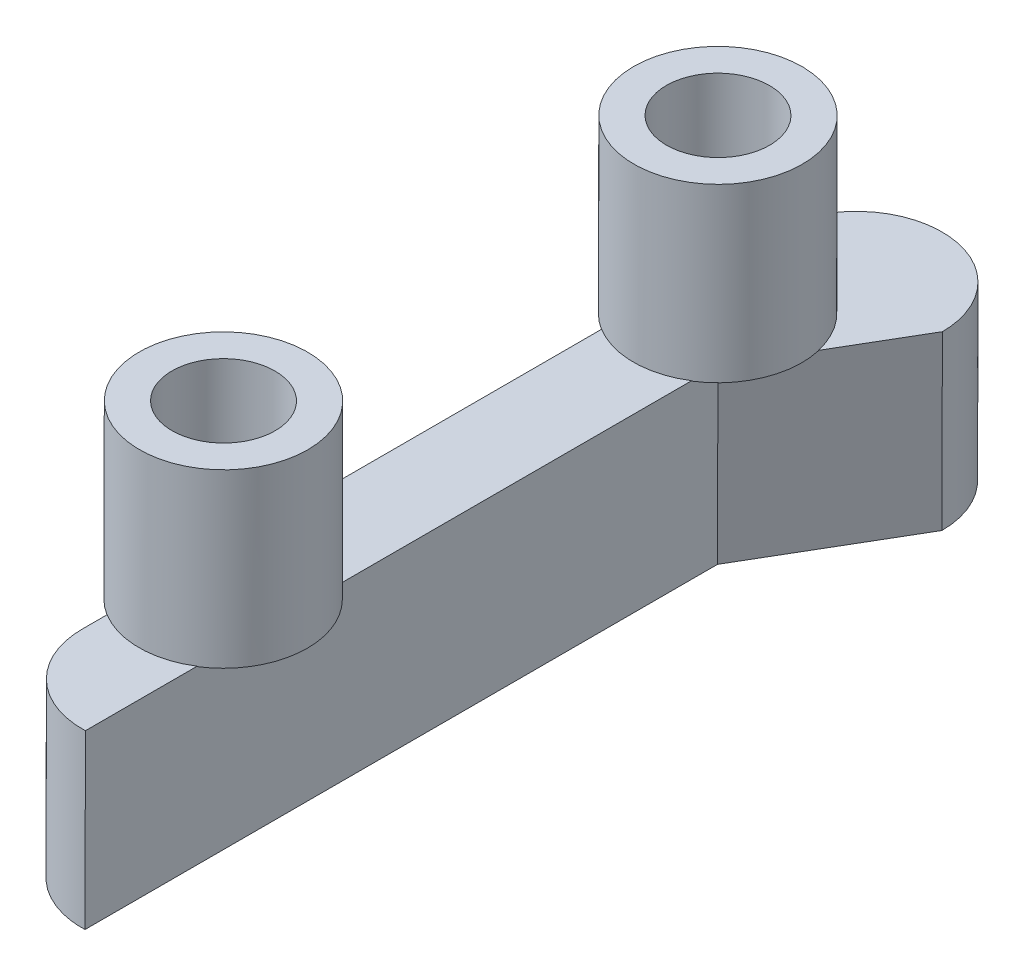
ISO-10303-21;
HEADER;
FILE_DESCRIPTION(('STEP AP214'),'2;1');
FILE_NAME('part.step','',(''),(''),'','','');
FILE_SCHEMA(('AUTOMOTIVE_DESIGN { 1 0 10303 214 1 1 1 1 }'));
ENDSEC;
DATA;
#1=APPLICATION_CONTEXT('core data for automotive mechanical design processes');
#2=APPLICATION_PROTOCOL_DEFINITION('international standard','automotive_design',2000,#1);
#3=PRODUCT_CONTEXT('',#1,'mechanical');
#4=PRODUCT('Part','Part','',(#3));
#5=PRODUCT_RELATED_PRODUCT_CATEGORY('part','',(#4));
#6=PRODUCT_DEFINITION_FORMATION('','',#4);
#7=PRODUCT_DEFINITION_CONTEXT('part definition',#1,'design');
#8=PRODUCT_DEFINITION('design','',#6,#7);
#9=PRODUCT_DEFINITION_SHAPE('','',#8);
#10=(LENGTH_UNIT() NAMED_UNIT(*) SI_UNIT(.MILLI.,.METRE.));
#11=(NAMED_UNIT(*) PLANE_ANGLE_UNIT() SI_UNIT($,.RADIAN.));
#12=(NAMED_UNIT(*) SI_UNIT($,.STERADIAN.) SOLID_ANGLE_UNIT());
#13=UNCERTAINTY_MEASURE_WITH_UNIT(LENGTH_MEASURE(1.E-05),#10,'distance_accuracy_value','');
#14=(GEOMETRIC_REPRESENTATION_CONTEXT(3) GLOBAL_UNCERTAINTY_ASSIGNED_CONTEXT((#13)) GLOBAL_UNIT_ASSIGNED_CONTEXT((#10,
#11,#12)) REPRESENTATION_CONTEXT('',''));
#15=CARTESIAN_POINT('',(0.,0.,0.));
#16=DIRECTION('',(0.,0.,1.));
#17=DIRECTION('',(1.,0.,0.));
#18=AXIS2_PLACEMENT_3D('',#15,#16,#17);
#19=CARTESIAN_POINT('',(57.3109271873669,88.1337830472261,1.83371146499802E-13));
#20=DIRECTION('',(-0.99999710519669,0.00240615839856679,0.));
#21=DIRECTION('',(-0.00240615839856679,-0.999997105196691,0.));
#22=AXIS2_PLACEMENT_3D('',#19,#20,#21);
#23=PLANE('',#22);
#24=DIRECTION('',(0.,0.,1.));
#25=VECTOR('',#24,1.);
#26=CARTESIAN_POINT('',(57.3109031257829,88.1237830761742,1.83348230583271E-13));
#27=LINE('',#26,#25);
#28=CARTESIAN_POINT('',(57.3109031257829,88.1237830761735,286.650795498264));
#29=VERTEX_POINT('',#28);
#30=CARTESIAN_POINT('',(57.3109031257829,88.1237830761735,287.961655492825));
#31=VERTEX_POINT('',#30);
#32=EDGE_CURVE('E50',#29,#31,#27,.T.);
#33=ORIENTED_EDGE('',*,*,#32,.F.);
#34=DIRECTION('',(-0.00240615839856679,-0.999997105196691,0.));
#35=VECTOR('',#34,1.);
#36=CARTESIAN_POINT('',(57.3229339177757,93.123768602157,286.650795498264));
#37=LINE('',#36,#35);
#38=CARTESIAN_POINT('',(57.3109271873669,88.1337830472255,286.650795498264));
#39=VERTEX_POINT('',#38);
#40=EDGE_CURVE('E259',#29,#39,#37,.F.);
#41=ORIENTED_EDGE('',*,*,#40,.T.);
#42=DIRECTION('',(0.,0.,1.));
#43=VECTOR('',#42,1.);
#44=CARTESIAN_POINT('',(57.3109271873669,88.1337830472261,1.83037572029885E-13));
#45=LINE('',#44,#43);
#46=CARTESIAN_POINT('',(57.3109271873669,88.1337830472255,276.455809082127));
#47=VERTEX_POINT('',#46);
#48=EDGE_CURVE('E491',#47,#39,#45,.T.);
#49=ORIENTED_EDGE('',*,*,#48,.F.);
#50=DIRECTION('',(-0.00240615839856679,-0.999997105196691,0.));
#51=VECTOR('',#50,1.);
#52=CARTESIAN_POINT('',(57.3229339177757,93.123768602157,276.455809082127));
#53=LINE('',#52,#51);
#54=CARTESIAN_POINT('',(57.3109031257829,88.1237830761736,276.455809082127));
#55=VERTEX_POINT('',#54);
#56=EDGE_CURVE('E284',#47,#55,#53,.T.);
#57=ORIENTED_EDGE('',*,*,#56,.T.);
#58=DIRECTION('',(0.,0.,-1.));
#59=VECTOR('',#58,1.);
#60=CARTESIAN_POINT('',(57.3109031257829,88.1237830761742,1.83348230583271E-13));
#61=LINE('',#60,#59);
#62=CARTESIAN_POINT('',(57.3109031257829,88.1237830761736,275.144949087566));
#63=VERTEX_POINT('',#62);
#64=EDGE_CURVE('E296',#55,#63,#61,.T.);
#65=ORIENTED_EDGE('',*,*,#64,.T.);
#66=DIRECTION('',(-0.00240615839856679,-0.999997105196691,0.));
#67=VECTOR('',#66,1.);
#68=CARTESIAN_POINT('',(57.3229339177757,93.123768602157,275.144949087566));
#69=LINE('',#68,#67);
#70=CARTESIAN_POINT('',(57.3109271873669,88.1337830472255,275.144949087566));
#71=VERTEX_POINT('',#70);
#72=EDGE_CURVE('E272',#71,#63,#69,.T.);
#73=ORIENTED_EDGE('',*,*,#72,.F.);
#74=CARTESIAN_POINT('',(57.3109271873669,88.1337830472255,273.593184533685));
#75=VERTEX_POINT('',#74);
#76=EDGE_CURVE('E537',#75,#71,#45,.T.);
#77=ORIENTED_EDGE('',*,*,#76,.F.);
#78=DIRECTION('',(-0.00240615839856679,-0.999997105196691,0.));
#79=VECTOR('',#78,1.);
#80=CARTESIAN_POINT('',(57.3229339177757,93.123768602157,273.593184533685));
#81=LINE('',#80,#79);
#82=CARTESIAN_POINT('',(57.3109031257829,88.1237830761736,273.593184533685));
#83=VERTEX_POINT('',#82);
#84=EDGE_CURVE('E278',#83,#75,#81,.F.);
#85=ORIENTED_EDGE('',*,*,#84,.F.);
#86=CARTESIAN_POINT('',(57.3109031257829,88.1237830761736,272.282324539124));
#87=VERTEX_POINT('',#86);
#88=EDGE_CURVE('E294',#83,#87,#61,.T.);
#89=ORIENTED_EDGE('',*,*,#88,.T.);
#90=DIRECTION('',(-0.00240615839856679,-0.999997105196691,0.));
#91=VECTOR('',#90,1.);
#92=CARTESIAN_POINT('',(57.3229339177757,93.123768602157,272.282324539124));
#93=LINE('',#92,#91);
#94=CARTESIAN_POINT('',(57.3109271873669,88.1337830472255,272.282324539124));
#95=VERTEX_POINT('',#94);
#96=EDGE_CURVE('E286',#87,#95,#93,.F.);
#97=ORIENTED_EDGE('',*,*,#96,.T.);
#98=CARTESIAN_POINT('',(57.3109271873669,88.1337830472255,271.553297735412));
#99=VERTEX_POINT('',#98);
#100=EDGE_CURVE('E182',#99,#95,#45,.T.);
#101=ORIENTED_EDGE('',*,*,#100,.F.);
#102=DIRECTION('',(-0.00240615839856679,-0.99999710519669,0.));
#103=VECTOR('',#102,1.);
#104=CARTESIAN_POINT('',(57.3109271873669,88.1337830472255,271.553297735412));
#105=LINE('',#104,#103);
#106=CARTESIAN_POINT('',(57.2988723337901,83.1237975501901,271.553297735412));
#107=VERTEX_POINT('',#106);
#108=EDGE_CURVE('E518',#99,#107,#105,.T.);
#109=ORIENTED_EDGE('',*,*,#108,.T.);
#110=DIRECTION('',(0.,0.,1.));
#111=VECTOR('',#110,1.);
#112=CARTESIAN_POINT('',(57.2988723337901,83.1237975501907,1.71556697847878E-13));
#113=LINE('',#112,#111);
#114=CARTESIAN_POINT('',(57.2988723337901,83.1237975501901,288.700730465903));
#115=VERTEX_POINT('',#114);
#116=EDGE_CURVE('E307',#107,#115,#113,.T.);
#117=ORIENTED_EDGE('',*,*,#116,.T.);
#118=CARTESIAN_POINT('',(57.2988723337901,83.1237975501901,291.553297735412));
#119=DIRECTION('',(0.,0.,-1.));
#120=VECTOR('',#119,1.);
#121=LINE('',#118,#120);
#122=CARTESIAN_POINT('',(57.2988723337901,83.1237975501901,291.553297735412));
#123=VERTEX_POINT('',#122);
#124=EDGE_CURVE('E301',#123,#115,#121,.T.);
#125=ORIENTED_EDGE('',*,*,#124,.F.);
#126=CARTESIAN_POINT('',(57.310903125783,88.1237830761735,291.553297735412));
#127=DIRECTION('',(-0.00240615839856712,-0.99999710519669,0.));
#128=VECTOR('',#127,1.);
#129=LINE('',#126,#128);
#130=CARTESIAN_POINT('',(57.3109031257829,88.1237830761735,291.553297735412));
#131=VERTEX_POINT('',#130);
#132=EDGE_CURVE('E341',#123,#131,#129,.F.);
#133=ORIENTED_EDGE('',*,*,#132,.T.);
#134=CARTESIAN_POINT('',(57.310927187367,88.1337830472255,291.553297735412));
#135=DIRECTION('',(-0.00240615839822043,-0.999997105196691,0.));
#136=VECTOR('',#135,1.);
#137=LINE('',#134,#136);
#138=CARTESIAN_POINT('',(57.3109271873669,88.1337830472255,291.553297735412));
#139=VERTEX_POINT('',#138);
#140=EDGE_CURVE('E460',#139,#131,#137,.T.);
#141=ORIENTED_EDGE('',*,*,#140,.F.);
#142=CARTESIAN_POINT('',(57.3109271873669,88.1337830472255,291.553297735412));
#143=DIRECTION('',(0.,0.,-1.));
#144=VECTOR('',#143,1.);
#145=LINE('',#142,#144);
#146=CARTESIAN_POINT('',(57.3109271873669,88.1337830472255,290.824280038259));
#147=VERTEX_POINT('',#146);
#148=EDGE_CURVE('E181',#139,#147,#145,.T.);
#149=ORIENTED_EDGE('',*,*,#148,.T.);
#150=DIRECTION('',(-0.00240615839856679,-0.999997105196691,0.));
#151=VECTOR('',#150,1.);
#152=CARTESIAN_POINT('',(57.3229339177757,93.123768602157,290.824280041267));
#153=LINE('',#152,#151);
#154=CARTESIAN_POINT('',(57.3109031257829,88.1237830761735,290.824280041267));
#155=VERTEX_POINT('',#154);
#156=EDGE_CURVE('E233',#147,#155,#153,.T.);
#157=ORIENTED_EDGE('',*,*,#156,.T.);
#158=CARTESIAN_POINT('',(57.3109031257829,88.1237830761735,289.513420046706));
#159=VERTEX_POINT('',#158);
#160=EDGE_CURVE('E188',#159,#155,#27,.T.);
#161=ORIENTED_EDGE('',*,*,#160,.F.);
#162=DIRECTION('',(-0.00240615839856679,-0.999997105196691,0.));
#163=VECTOR('',#162,1.);
#164=CARTESIAN_POINT('',(57.3229339177757,93.123768602157,289.513420046706));
#165=LINE('',#164,#163);
#166=CARTESIAN_POINT('',(57.3109271873452,88.1337830472256,289.51342004667));
#167=VERTEX_POINT('',#166);
#168=EDGE_CURVE('E186',#167,#159,#165,.T.);
#169=ORIENTED_EDGE('',*,*,#168,.F.);
#170=CARTESIAN_POINT('',(57.3109271873669,88.1337830472255,289.513420046657));
#171=DIRECTION('',(0.,0.,-1.));
#172=VECTOR('',#171,1.);
#173=LINE('',#170,#172);
#174=CARTESIAN_POINT('',(57.3109271873669,88.1337830472255,288.700730465903));
#175=VERTEX_POINT('',#174);
#176=EDGE_CURVE('E172',#167,#175,#173,.T.);
#177=ORIENTED_EDGE('',*,*,#176,.T.);
#178=CARTESIAN_POINT('',(57.3109271873669,88.1337830472255,287.961655492825));
#179=VERTEX_POINT('',#178);
#180=EDGE_CURVE('E179',#179,#175,#45,.T.);
#181=ORIENTED_EDGE('',*,*,#180,.F.);
#182=DIRECTION('',(-0.00240615839856679,-0.999997105196691,0.));
#183=VECTOR('',#182,1.);
#184=CARTESIAN_POINT('',(57.3229339177757,93.123768602157,287.961655492825));
#185=LINE('',#184,#183);
#186=EDGE_CURVE('E55',#31,#179,#185,.F.);
#187=ORIENTED_EDGE('',*,*,#186,.F.);
#188=EDGE_LOOP('',(#33,#41,#49,#57,#65,#73,#77,#85,#89,#97,#101,#109,#117,#125,#133,#141,#149,
#157,#161,#169,#177,#181,#187));
#189=FACE_BOUND('',#188,.T.);
#190=ADVANCED_FACE('F35',(#189),#23,.T.);
#191=CARTESIAN_POINT('',(59.9079896844854,88.1275340853975,1.82972472427624E-13));
#192=DIRECTION('',(-0.99999710519669,0.00240615839856679,0.));
#193=DIRECTION('',(-0.00240615839856679,-0.999997105196691,0.));
#194=AXIS2_PLACEMENT_3D('',#191,#192,#193);
#195=PLANE('',#194);
#196=DIRECTION('',(-0.00240615839856679,-0.999997105196691,0.));
#197=VECTOR('',#196,1.);
#198=CARTESIAN_POINT('',(59.9199964148942,93.1175196403284,286.66928174163));
#199=LINE('',#198,#197);
#200=CARTESIAN_POINT('',(59.9079656229014,88.117534114345,286.66928174163));
#201=VERTEX_POINT('',#200);
#202=CARTESIAN_POINT('',(59.9079896844854,88.127534085397,286.66928174163));
#203=VERTEX_POINT('',#202);
#204=EDGE_CURVE('E255',#201,#203,#199,.F.);
#205=ORIENTED_EDGE('',*,*,#204,.F.);
#206=DIRECTION('',(0.,0.,1.));
#207=VECTOR('',#206,1.);
#208=CARTESIAN_POINT('',(59.9079656229014,88.1175341143456,1.82949556511093E-13));
#209=LINE('',#208,#207);
#210=CARTESIAN_POINT('',(59.9079656229014,88.117534114345,288.012842662898));
#211=VERTEX_POINT('',#210);
#212=EDGE_CURVE('E11',#201,#211,#209,.T.);
#213=ORIENTED_EDGE('',*,*,#212,.T.);
#214=DIRECTION('',(-0.00240615839856679,-0.999997105196691,0.));
#215=VECTOR('',#214,1.);
#216=CARTESIAN_POINT('',(59.9199964148942,93.1175196403284,288.012842662898));
#217=LINE('',#216,#215);
#218=CARTESIAN_POINT('',(59.9079896844854,88.127534085397,288.012842662898));
#219=VERTEX_POINT('',#218);
#220=EDGE_CURVE('E192',#211,#219,#217,.F.);
#221=ORIENTED_EDGE('',*,*,#220,.T.);
#222=DIRECTION('',(0.,0.,-1.));
#223=VECTOR('',#222,1.);
#224=CARTESIAN_POINT('',(59.9079896844854,88.1275340853975,1.82972472427624E-13));
#225=LINE('',#224,#223);
#226=CARTESIAN_POINT('',(59.9079896844854,88.127534085397,289.462232876634));
#227=VERTEX_POINT('',#226);
#228=EDGE_CURVE('E496',#227,#219,#225,.T.);
#229=ORIENTED_EDGE('',*,*,#228,.F.);
#230=DIRECTION('',(-0.00240615839856679,-0.999997105196691,0.));
#231=VECTOR('',#230,1.);
#232=CARTESIAN_POINT('',(59.9199964148942,93.1175196403284,289.462232876634));
#233=LINE('',#232,#231);
#234=CARTESIAN_POINT('',(59.9079656229014,88.117534114345,289.462232876634));
#235=VERTEX_POINT('',#234);
#236=EDGE_CURVE('E193',#227,#235,#233,.T.);
#237=ORIENTED_EDGE('',*,*,#236,.T.);
#238=CARTESIAN_POINT('',(59.9079656229014,88.117534114345,290.805793797901));
#239=VERTEX_POINT('',#238);
#240=EDGE_CURVE('E39',#235,#239,#209,.T.);
#241=ORIENTED_EDGE('',*,*,#240,.T.);
#242=DIRECTION('',(-0.00240615839856679,-0.999997105196691,0.));
#243=VECTOR('',#242,1.);
#244=CARTESIAN_POINT('',(59.9199964148942,93.1175196403284,290.805793797901));
#245=LINE('',#244,#243);
#246=CARTESIAN_POINT('',(59.9079896844854,88.127534085397,290.805793797901));
#247=VERTEX_POINT('',#246);
#248=EDGE_CURVE('E220',#247,#239,#245,.T.);
#249=ORIENTED_EDGE('',*,*,#248,.F.);
#250=CARTESIAN_POINT('',(59.9079896844854,88.1275340853969,294.0514244806));
#251=VERTEX_POINT('',#250);
#252=EDGE_CURVE('E459',#251,#247,#225,.T.);
#253=ORIENTED_EDGE('',*,*,#252,.F.);
#254=DIRECTION('',(-0.00240615839856679,-0.99999710519669,0.));
#255=VECTOR('',#254,1.);
#256=CARTESIAN_POINT('',(59.9079896844854,88.1275340853969,294.0514244806));
#257=LINE('',#256,#255);
#258=CARTESIAN_POINT('',(59.8959348309086,83.1175485883615,294.0514244806));
#259=VERTEX_POINT('',#258);
#260=EDGE_CURVE('E458',#251,#259,#257,.T.);
#261=ORIENTED_EDGE('',*,*,#260,.T.);
#262=DIRECTION('',(0.,0.,-1.));
#263=VECTOR('',#262,1.);
#264=CARTESIAN_POINT('',(59.8959348309086,83.1175485883621,1.71491598245617E-13));
#265=LINE('',#264,#263);
#266=CARTESIAN_POINT('',(59.8959348309086,83.1175485883616,275.67241835627));
#267=VERTEX_POINT('',#266);
#268=EDGE_CURVE('E333',#259,#267,#265,.T.);
#269=ORIENTED_EDGE('',*,*,#268,.T.);
#270=DIRECTION('',(-0.00240615839856679,-0.99999710519669,0.));
#271=VECTOR('',#270,1.);
#272=CARTESIAN_POINT('',(59.9079896844854,88.127534085397,275.67241835627));
#273=LINE('',#272,#271);
#274=CARTESIAN_POINT('',(59.9079656229014,88.117534114345,275.67241835627));
#275=VERTEX_POINT('',#274);
#276=EDGE_CURVE('E453',#275,#267,#273,.T.);
#277=ORIENTED_EDGE('',*,*,#276,.F.);
#278=DIRECTION('',(0.,0.,-1.));
#279=VECTOR('',#278,1.);
#280=CARTESIAN_POINT('',(59.9079656229014,88.1175341143456,1.82949556511093E-13));
#281=LINE('',#280,#279);
#282=CARTESIAN_POINT('',(59.9079656229014,88.117534114345,276.437322838761));
#283=VERTEX_POINT('',#282);
#284=EDGE_CURVE('E200',#283,#275,#281,.T.);
#285=ORIENTED_EDGE('',*,*,#284,.F.);
#286=DIRECTION('',(-0.00240615839856679,-0.999997105196691,0.));
#287=VECTOR('',#286,1.);
#288=CARTESIAN_POINT('',(59.9199964148942,93.1175196403285,276.437322838761));
#289=LINE('',#288,#287);
#290=CARTESIAN_POINT('',(59.9079896844854,88.127534085397,276.437322838761));
#291=VERTEX_POINT('',#290);
#292=EDGE_CURVE('E281',#291,#283,#289,.T.);
#293=ORIENTED_EDGE('',*,*,#292,.F.);
#294=EDGE_CURVE('E493',#203,#291,#225,.T.);
#295=ORIENTED_EDGE('',*,*,#294,.F.);
#296=EDGE_LOOP('',(#205,#213,#221,#229,#237,#241,#249,#253,#261,#269,#277,#285,#293,#295));
#297=FACE_BOUND('',#296,.T.);
#298=ADVANCED_FACE('F218',(#297),#195,.F.);
#299=CARTESIAN_POINT('',(0.212395035636527,88.2711715576215,1.83371146499802E-13));
#300=DIRECTION('',(0.0024061583985665,0.999997105196691,0.));
#301=DIRECTION('',(-0.999997105196691,0.0024061583985665,0.));
#302=AXIS2_PLACEMENT_3D('',#299,#300,#301);
#303=PLANE('',#302);
#304=CARTESIAN_POINT('',(58.5946706006051,88.1306941482884,288.737537769766));
#305=DIRECTION('',(0.0024061583985665,0.999997105196691,0.));
#306=DIRECTION('',(-0.999997105196691,0.0024061583985665,0.));
#307=AXIS2_PLACEMENT_3D('',#304,#305,#306);
#308=CIRCLE('',#307,1.49999999999999);
#309=EDGE_CURVE('E199',#179,#219,#308,.F.);
#310=ORIENTED_EDGE('',*,*,#309,.F.);
#311=ORIENTED_EDGE('',*,*,#180,.T.);
#312=ORIENTED_EDGE('',*,*,#176,.F.);
#313=EDGE_CURVE('E177',#227,#167,#308,.F.);
#314=ORIENTED_EDGE('',*,*,#313,.F.);
#315=ORIENTED_EDGE('',*,*,#228,.T.);
#316=EDGE_LOOP('',(#310,#311,#312,#314,#315));
#317=FACE_BOUND('',#316,.T.);
#318=ADVANCED_FACE('F175',(#317),#303,.T.);
#319=ORIENTED_EDGE('',*,*,#48,.T.);
#320=CARTESIAN_POINT('',(58.5946706006051,88.1306941482884,288.737537769766));
#321=DIRECTION('',(0.0024061583985665,0.999997105196691,0.));
#322=DIRECTION('',(-0.999997105196691,0.0024061583985665,0.));
#323=AXIS2_PLACEMENT_3D('',#320,#321,#322);
#324=CIRCLE('',#323,2.44999999999997);
#325=EDGE_CURVE('E209',#39,#203,#324,.F.);
#326=ORIENTED_EDGE('',*,*,#325,.T.);
#327=ORIENTED_EDGE('',*,*,#294,.T.);
#328=CARTESIAN_POINT('',(58.5946706006051,88.1306941482884,274.369066810625));
#329=DIRECTION('',(0.0024061583985665,0.999997105196691,0.));
#330=DIRECTION('',(-0.999997105196691,0.0024061583985665,0.));
#331=AXIS2_PLACEMENT_3D('',#328,#329,#330);
#332=CIRCLE('',#331,2.44999999999997);
#333=EDGE_CURVE('E526',#291,#47,#332,.F.);
#334=ORIENTED_EDGE('',*,*,#333,.T.);
#335=EDGE_LOOP('',(#319,#326,#327,#334));
#336=FACE_BOUND('',#335,.T.);
#337=ADVANCED_FACE('F568',(#336),#303,.T.);
#338=CARTESIAN_POINT('',(164.735206395758,87.8753024673482,95.9762962601393));
#339=DIRECTION('',(-0.863766395322566,0.00207836478296356,-0.503888176792519));
#340=DIRECTION('',(-0.503889265093773,0.,0.863768260891345));
#341=AXIS2_PLACEMENT_3D('',#338,#339,#340);
#342=PLANE('',#341);
#343=DIRECTION('',(0.503886718135358,-0.00121243476852585,-0.863768895763624));
#344=VECTOR('',#343,1.);
#345=CARTESIAN_POINT('',(164.735182334174,87.8653024962963,95.9762962601393));
#346=LINE('',#345,#344);
#347=CARTESIAN_POINT('',(60.9840843380596,88.1149447947651,273.827722235399));
#348=VERTEX_POINT('',#347);
#349=EDGE_CURVE('E291',#275,#348,#346,.T.);
#350=ORIENTED_EDGE('',*,*,#349,.F.);
#351=ORIENTED_EDGE('',*,*,#276,.T.);
#352=DIRECTION('',(0.503886718135358,-0.00121243476852588,-0.863768895763624));
#353=VECTOR('',#352,1.);
#354=CARTESIAN_POINT('',(164.723151542181,82.8653169703128,95.9762962601393));
#355=LINE('',#354,#353);
#356=CARTESIAN_POINT('',(62.2988578597735,83.1117667581973,271.553297735412));
#357=VERTEX_POINT('',#356);
#358=EDGE_CURVE('E353',#267,#357,#355,.T.);
#359=ORIENTED_EDGE('',*,*,#358,.T.);
#360=DIRECTION('',(-0.00240615839856679,-0.99999710519669,0.));
#361=VECTOR('',#360,1.);
#362=CARTESIAN_POINT('',(62.3109127133504,88.1217522552327,271.553297735412));
#363=LINE('',#362,#361);
#364=CARTESIAN_POINT('',(62.3109127133504,88.1217522552327,271.553297735412));
#365=VERTEX_POINT('',#364);
#366=EDGE_CURVE('E517',#365,#357,#363,.T.);
#367=ORIENTED_EDGE('',*,*,#366,.F.);
#368=DIRECTION('',(0.503886718135358,-0.00121243476852588,-0.863768895763624));
#369=VECTOR('',#368,1.);
#370=CARTESIAN_POINT('',(164.735206395758,87.8753024673482,95.9762962601393));
#371=LINE('',#370,#369);
#372=CARTESIAN_POINT('',(60.9841083996436,88.1249447658171,273.827722235399));
#373=VERTEX_POINT('',#372);
#374=EDGE_CURVE('E520',#373,#365,#371,.T.);
#375=ORIENTED_EDGE('',*,*,#374,.F.);
#376=DIRECTION('',(-0.00240615839856679,-0.999997105196691,0.));
#377=VECTOR('',#376,1.);
#378=CARTESIAN_POINT('',(60.9961151300524,93.1149303207485,273.827722235399));
#379=LINE('',#378,#377);
#380=EDGE_CURVE('E288',#348,#373,#379,.F.);
#381=ORIENTED_EDGE('',*,*,#380,.F.);
#382=EDGE_LOOP('',(#350,#351,#359,#367,#375,#381));
#383=FACE_BOUND('',#382,.T.);
#384=ADVANCED_FACE('F37',(#383),#342,.F.);
#385=ORIENTED_EDGE('',*,*,#100,.T.);
#386=EDGE_CURVE('E205',#95,#373,#332,.F.);
#387=ORIENTED_EDGE('',*,*,#386,.T.);
#388=ORIENTED_EDGE('',*,*,#374,.T.);
#389=CARTESIAN_POINT('',(57.310927187367,88.1337830472255,271.553297735412));
#390=CARTESIAN_POINT('',(57.310927187367,88.1337830472255,271.222630202525));
#391=CARTESIAN_POINT('',(57.3775193933387,88.133622815366,270.894119026298));
#392=CARTESIAN_POINT('',(57.6274938656762,88.1330213354487,270.292896189899));
#393=CARTESIAN_POINT('',(57.8139516337614,88.1325726872253,270.014407111398));
#394=CARTESIAN_POINT('',(58.1596716799845,88.1317408276245,269.669183662939));
#395=CARTESIAN_POINT('',(58.2881883009698,88.1314315953824,269.563834414795));
#396=CARTESIAN_POINT('',(58.5600448763767,88.1307774635067,269.38258543413));
#397=CARTESIAN_POINT('',(58.703639360004,88.1304319514337,269.30591032023));
#398=CARTESIAN_POINT('',(59.0063271133396,88.1297036346456,269.180650644761));
#399=CARTESIAN_POINT('',(59.1652954636067,88.1293211305072,269.132607362286));
#400=CARTESIAN_POINT('',(59.4851203779998,88.1285515788757,269.069262852838));
#401=CARTESIAN_POINT('',(59.6476583676913,88.1281604855945,269.053165346251));
#402=CARTESIAN_POINT('',(59.9782111540015,88.1273651209292,269.053431748368));
#403=CARTESIAN_POINT('',(60.1408489900447,88.1269737874012,269.069813240045));
#404=CARTESIAN_POINT('',(60.4604123325068,88.126204865155,269.133647710428));
#405=CARTESIAN_POINT('',(60.6191022414493,88.1258230309925,269.181865968998));
#406=CARTESIAN_POINT('',(60.9217286183413,88.1250948618862,269.307646832161));
#407=CARTESIAN_POINT('',(61.06513188889,88.1247498099035,269.384527638184));
#408=CARTESIAN_POINT('',(61.3363729290489,88.1240971591074,269.56593763567));
#409=CARTESIAN_POINT('',(61.4648064159335,88.1237881268997,269.6714933224));
#410=CARTESIAN_POINT('',(61.6950519328693,88.1232341181116,269.902064788183));
#411=CARTESIAN_POINT('',(61.79834430292,88.1229855795885,270.027822449333));
#412=CARTESIAN_POINT('',(61.9807707162031,88.1225466314714,270.300830702426));
#413=CARTESIAN_POINT('',(62.0583971587978,88.1223598494139,270.446352329882));
#414=CARTESIAN_POINT('',(62.1829901236278,88.1220600581373,270.747219765197));
#415=CARTESIAN_POINT('',(62.2309603962796,88.1219446337287,270.904868208917));
#416=CARTESIAN_POINT('',(62.2950839956756,88.1217903417449,271.227746224922));
#417=CARTESIAN_POINT('',(62.3109127133504,88.1217522552326,271.390083561401));
#418=CARTESIAN_POINT('',(62.3109127133504,88.1217522552326,271.553297735412));
#419=B_SPLINE_CURVE_WITH_KNOTS('',3,(#389,#390,#391,#392,#393,#394,#395,#396,#397,#398,#399,
#400,#401,#402,#403,#404,#405,#406,#407,#408,#409,#410,#411,#412,#413,#414,#415,#416,#417,#418),
.UNSPECIFIED.,.F.,.F.,(4,2,2,2,2,2,2,2,2,2,2,2,2,2,4),(0.,0.125000000000008,0.250000000000015,
0.312500000000014,0.375000000000013,0.437500000000012,0.50000000000001,0.562500000000009,
0.625000000000008,0.687500000000006,0.750000000000005,0.812500000000004,0.875000000000003,
0.937500000000001,1.),.UNSPECIFIED.);
#420=EDGE_CURVE('E492',#365,#99,#419,.F.);
#421=ORIENTED_EDGE('',*,*,#420,.T.);
#422=EDGE_LOOP('',(#385,#387,#388,#421));
#423=FACE_BOUND('',#422,.T.);
#424=ADVANCED_FACE('F543',(#423),#303,.T.);
#425=CARTESIAN_POINT('',(58.5946706006051,88.1306941482884,274.369066810625));
#426=DIRECTION('',(0.0024061583985665,0.999997105196691,0.));
#427=DIRECTION('',(-0.999997105196691,0.0024061583985665,0.));
#428=AXIS2_PLACEMENT_3D('',#425,#426,#427);
#429=CIRCLE('',#428,1.5);
#430=EDGE_CURVE('E523',#75,#71,#429,.F.);
#431=ORIENTED_EDGE('',*,*,#430,.F.);
#432=ORIENTED_EDGE('',*,*,#76,.T.);
#433=EDGE_LOOP('',(#431,#432));
#434=FACE_BOUND('',#433,.T.);
#435=ADVANCED_FACE('F389',(#434),#303,.T.);
#436=CARTESIAN_POINT('',(62.3109127133504,88.1217522552326,271.553297735412));
#437=CARTESIAN_POINT('',(62.3109127133504,88.1217522552326,271.390083561401));
#438=CARTESIAN_POINT('',(62.2950839956756,88.1217903417449,271.227746224922));
#439=CARTESIAN_POINT('',(62.2309603962796,88.1219446337287,270.904868208917));
#440=CARTESIAN_POINT('',(62.1829901236278,88.1220600581373,270.747219765197));
#441=CARTESIAN_POINT('',(62.0583971587978,88.1223598494139,270.446352329882));
#442=CARTESIAN_POINT('',(61.9807707162031,88.1225466314714,270.300830702426));
#443=CARTESIAN_POINT('',(61.79834430292,88.1229855795885,270.027822449333));
#444=CARTESIAN_POINT('',(61.6950519328693,88.1232341181116,269.902064788183));
#445=CARTESIAN_POINT('',(61.4648064159335,88.1237881268997,269.6714933224));
#446=CARTESIAN_POINT('',(61.3363729290489,88.1240971591074,269.56593763567));
#447=CARTESIAN_POINT('',(61.06513188889,88.1247498099035,269.384527638184));
#448=CARTESIAN_POINT('',(60.9217286183413,88.1250948618862,269.307646832161));
#449=CARTESIAN_POINT('',(60.6191022414493,88.1258230309925,269.181865968998));
#450=CARTESIAN_POINT('',(60.4604123325068,88.126204865155,269.133647710428));
#451=CARTESIAN_POINT('',(60.1408489900447,88.1269737874012,269.069813240045));
#452=CARTESIAN_POINT('',(59.9782111540015,88.1273651209292,269.053431748368));
#453=CARTESIAN_POINT('',(59.6476583676913,88.1281604855945,269.053165346251));
#454=CARTESIAN_POINT('',(59.4851203779998,88.1285515788757,269.069262852838));
#455=CARTESIAN_POINT('',(59.1652954636067,88.1293211305072,269.132607362286));
#456=CARTESIAN_POINT('',(59.0063271133396,88.1297036346456,269.180650644761));
#457=CARTESIAN_POINT('',(58.703639360004,88.1304319514337,269.30591032023));
#458=CARTESIAN_POINT('',(58.5600448763767,88.1307774635067,269.38258543413));
#459=CARTESIAN_POINT('',(58.2881883009698,88.1314315953824,269.563834414795));
#460=CARTESIAN_POINT('',(58.1596716799845,88.1317408276245,269.669183662939));
#461=CARTESIAN_POINT('',(57.8139516337614,88.1325726872253,270.014407111398));
#462=CARTESIAN_POINT('',(57.6274938656762,88.1330213354487,270.292896189899));
#463=CARTESIAN_POINT('',(57.3775193933387,88.133622815366,270.894119026298));
#464=CARTESIAN_POINT('',(57.310927187367,88.1337830472255,271.222630202525));
#465=CARTESIAN_POINT('',(57.310927187367,88.1337830472255,271.553297735412));
#466=B_SPLINE_CURVE_WITH_KNOTS('',3,(#436,#437,#438,#439,#440,#441,#442,#443,#444,#445,#446,
#447,#448,#449,#450,#451,#452,#453,#454,#455,#456,#457,#458,#459,#460,#461,#462,#463,#464,#465),
.UNSPECIFIED.,.F.,.F.,(4,2,2,2,2,2,2,2,2,2,2,2,2,2,4),(0.,0.0624999999999987,0.124999999999997,
0.187499999999996,0.249999999999995,0.312499999999994,0.374999999999992,0.437499999999991,
0.49999999999999,0.562499999999988,0.624999999999987,0.687499999999986,0.749999999999985,
0.874999999999992,1.),.UNSPECIFIED.);
#467=DIRECTION('',(-0.00240615839856679,-0.99999710519669,0.));
#468=VECTOR('',#467,1.);
#469=SURFACE_OF_LINEAR_EXTRUSION('',#466,#468);
#470=ORIENTED_EDGE('',*,*,#366,.T.);
#471=CARTESIAN_POINT('',(62.2988578597736,83.1117667581973,271.553297735412));
#472=CARTESIAN_POINT('',(62.2988578597736,83.1117667581973,271.390083561401));
#473=CARTESIAN_POINT('',(62.2830291420988,83.1118048447095,271.227746224922));
#474=CARTESIAN_POINT('',(62.2189055427027,83.1119591366934,270.904868208917));
#475=CARTESIAN_POINT('',(62.170935270051,83.1120745611019,270.747219765197));
#476=CARTESIAN_POINT('',(62.046342305221,83.1123743523785,270.446352329882));
#477=CARTESIAN_POINT('',(61.9687158626263,83.112561134436,270.300830702426));
#478=CARTESIAN_POINT('',(61.7862894493431,83.1130000825531,270.027822449333));
#479=CARTESIAN_POINT('',(61.6829970792924,83.1132486210763,269.902064788183));
#480=CARTESIAN_POINT('',(61.4527515623566,83.1138026298643,269.6714933224));
#481=CARTESIAN_POINT('',(61.3243180754721,83.114111662072,269.56593763567));
#482=CARTESIAN_POINT('',(61.0530770353132,83.1147643128682,269.384527638184));
#483=CARTESIAN_POINT('',(60.9096737647645,83.1151093648508,269.307646832161));
#484=CARTESIAN_POINT('',(60.6070473878725,83.1158375339571,269.181865968998));
#485=CARTESIAN_POINT('',(60.44835747893,83.1162193681196,269.133647710428));
#486=CARTESIAN_POINT('',(60.1287941364679,83.1169882903659,269.069813240045));
#487=CARTESIAN_POINT('',(59.9661563004247,83.1173796238938,269.053431748368));
#488=CARTESIAN_POINT('',(59.6356035141145,83.1181749885592,269.053165346251));
#489=CARTESIAN_POINT('',(59.473065524423,83.1185660818403,269.069262852838));
#490=CARTESIAN_POINT('',(59.1532406100299,83.1193356334718,269.132607362286));
#491=CARTESIAN_POINT('',(58.9942722597627,83.1197181376102,269.180650644761));
#492=CARTESIAN_POINT('',(58.6915845064272,83.1204464543984,269.30591032023));
#493=CARTESIAN_POINT('',(58.5479900227999,83.1207919664713,269.38258543413));
#494=CARTESIAN_POINT('',(58.2761334473929,83.121446098347,269.563834414795));
#495=CARTESIAN_POINT('',(58.1476168264077,83.1217553305891,269.669183662939));
#496=CARTESIAN_POINT('',(57.8018967801846,83.12258719019,270.014407111398));
#497=CARTESIAN_POINT('',(57.6154390120994,83.1230358384134,270.292896189899));
#498=CARTESIAN_POINT('',(57.3654645397619,83.1236373183306,270.894119026298));
#499=CARTESIAN_POINT('',(57.2988723337902,83.1237975501901,271.222630202525));
#500=CARTESIAN_POINT('',(57.2988723337902,83.1237975501901,271.553297735412));
#501=B_SPLINE_CURVE_WITH_KNOTS('',3,(#471,#472,#473,#474,#475,#476,#477,#478,#479,#480,#481,
#482,#483,#484,#485,#486,#487,#488,#489,#490,#491,#492,#493,#494,#495,#496,#497,#498,#499,#500),
.UNSPECIFIED.,.F.,.F.,(4,2,2,2,2,2,2,2,2,2,2,2,2,2,4),(0.,0.0624999999999987,0.124999999999997,
0.187499999999996,0.249999999999995,0.312499999999994,0.374999999999992,0.437499999999991,
0.49999999999999,0.562499999999988,0.624999999999987,0.687499999999986,0.749999999999985,
0.874999999999992,1.),.UNSPECIFIED.);
#502=EDGE_CURVE('E348',#357,#107,#501,.T.);
#503=ORIENTED_EDGE('',*,*,#502,.T.);
#504=ORIENTED_EDGE('',*,*,#108,.F.);
#505=ORIENTED_EDGE('',*,*,#420,.F.);
#506=EDGE_LOOP('',(#470,#503,#504,#505));
#507=FACE_BOUND('',#506,.T.);
#508=ADVANCED_FACE('F384',(#507),#469,.F.);
#509=CARTESIAN_POINT('',(62.3109127133506,88.1217522552326,291.553297735401));
#510=CARTESIAN_POINT('',(62.3109127133513,88.1217522552326,291.71628356602));
#511=CARTESIAN_POINT('',(62.2951248770149,88.1217902433775,291.877125317336));
#512=CARTESIAN_POINT('',(62.232667370232,88.1219405264671,292.19460860293));
#513=CARTESIAN_POINT('',(62.1858307411731,88.1220532231417,292.350326341792));
#514=CARTESIAN_POINT('',(62.0048176382789,88.1224887706003,292.793756981808));
#515=CARTESIAN_POINT('',(61.8256522945633,88.1229198720448,293.067776880497));
#516=CARTESIAN_POINT('',(61.3782309442652,88.1239964418009,293.527212380731));
#517=CARTESIAN_POINT('',(61.1033365390366,88.1246578831975,293.718700324999));
#518=CARTESIAN_POINT('',(60.6478235655399,88.1257539227372,293.914847640639));
#519=CARTESIAN_POINT('',(60.4851580039677,88.1261453229774,293.966610935043));
#520=CARTESIAN_POINT('',(60.1535327799055,88.1269432681053,294.035493528217));
#521=CARTESIAN_POINT('',(59.9855438774845,88.1273474771838,294.052993889667));
#522=CARTESIAN_POINT('',(59.6451071089702,88.1281666243448,294.053593817583));
#523=CARTESIAN_POINT('',(59.4727243294369,88.1285814058183,294.036058258458));
#524=CARTESIAN_POINT('',(59.1421395616697,88.1293768474363,293.968086951305));
#525=CARTESIAN_POINT('',(58.9799097899566,88.129767199094,293.917064600178));
#526=CARTESIAN_POINT('',(58.6724367641728,88.130507030039,293.785297781654));
#527=CARTESIAN_POINT('',(58.5283761085695,88.1308536637989,293.705507049733));
#528=CARTESIAN_POINT('',(58.258030804718,88.1315041593053,293.519373650043));
#529=CARTESIAN_POINT('',(58.1326634870265,88.1318058138029,293.413227177971));
#530=CARTESIAN_POINT('',(57.7957405771156,88.132616506039,293.067438733255));
#531=CARTESIAN_POINT('',(57.6168454780385,88.1330469572302,292.793481689977));
#532=CARTESIAN_POINT('',(57.435832863397,88.133482503514,292.349815403384));
#533=CARTESIAN_POINT('',(57.3889456865555,88.1335953218149,292.193718570748));
#534=CARTESIAN_POINT('',(57.3266382105078,88.1337452439057,291.876470518967));
#535=CARTESIAN_POINT('',(57.310927187367,88.1337830472254,291.715881830577));
#536=CARTESIAN_POINT('',(57.310927187367,88.1337830472254,291.553297735412));
#537=B_SPLINE_CURVE_WITH_KNOTS('',3,(#509,#510,#511,#512,#513,#514,#515,#516,#517,#518,#519,
#520,#521,#522,#523,#524,#525,#526,#527,#528,#529,#530,#531,#532,#533,#534,#535,#536),
.UNSPECIFIED.,.F.,.F.,(4,2,2,2,2,2,2,2,2,2,2,2,2,4),(0.,0.062499999999998,0.124999999999996,
0.249999999999992,0.374999999999988,0.43749999999999,0.499999999999991,0.562499999999993,
0.624999999999995,0.687499999999997,0.749999999999998,0.875000000000002,0.937500000000001,1.),.UNSPECIFIED.);
#538=DIRECTION('',(-0.00240615839856679,-0.99999710519669,0.));
#539=VECTOR('',#538,1.);
#540=SURFACE_OF_LINEAR_EXTRUSION('',#537,#539);
#541=ORIENTED_EDGE('',*,*,#140,.T.);
#542=ORIENTED_EDGE('',*,*,#132,.F.);
#543=CARTESIAN_POINT('',(57.2988723337901,83.1237975501901,291.553297735412));
#544=CARTESIAN_POINT('',(57.2988723337902,83.1237975501901,291.715881830577));
#545=CARTESIAN_POINT('',(57.314583356931,83.1237597468704,291.876470518967));
#546=CARTESIAN_POINT('',(57.3768908329787,83.1236098247796,292.193718570748));
#547=CARTESIAN_POINT('',(57.4237780098201,83.1234970064786,292.349815403384));
#548=CARTESIAN_POINT('',(57.6047906244617,83.1230614601948,292.793481689977));
#549=CARTESIAN_POINT('',(57.7836857235388,83.1226310090037,293.067438733255));
#550=CARTESIAN_POINT('',(58.1206086334497,83.1218203167675,293.413227177971));
#551=CARTESIAN_POINT('',(58.2459759511412,83.1215186622699,293.519373650043));
#552=CARTESIAN_POINT('',(58.5163212549927,83.1208681667635,293.705507049733));
#553=CARTESIAN_POINT('',(58.660381910596,83.1205215330037,293.785297781654));
#554=CARTESIAN_POINT('',(58.9678549363798,83.1197817020587,293.917064600178));
#555=CARTESIAN_POINT('',(59.1300847080929,83.119391350401,293.968086951305));
#556=CARTESIAN_POINT('',(59.4606694758601,83.1185959087829,294.036058258458));
#557=CARTESIAN_POINT('',(59.6330522553934,83.1181811273095,294.053593817583));
#558=CARTESIAN_POINT('',(59.834232360182,83.1176970547094,294.053239291949));
#559=CARTESIAN_POINT('',(59.8651203172699,83.1176227331769,294.052615647122));
#560=CARTESIAN_POINT('',(59.8959348310229,83.1175485883612,294.0514244806));
#561=B_SPLINE_CURVE_WITH_KNOTS('',3,(#543,#544,#545,#546,#547,#548,#549,#550,#551,#552,#553,
#554,#555,#556,#557,#558,#559,#560),.UNSPECIFIED.,.F.,.F.,(4,2,2,2,2,2,2,2,4),(0.48863161848432,
0.551131618484319,0.613631618484318,0.738631618484322,0.801131618484323,0.863631618484325,
0.926131618484327,0.988631618484329,1.),.UNSPECIFIED.);
#562=EDGE_CURVE('E342',#259,#123,#561,.F.);
#563=ORIENTED_EDGE('',*,*,#562,.F.);
#564=ORIENTED_EDGE('',*,*,#260,.F.);
#565=CARTESIAN_POINT('',(59.9079896845998,88.1275340853966,294.0514244806));
#566=CARTESIAN_POINT('',(59.8771751708467,88.1276082302123,294.052615647122));
#567=CARTESIAN_POINT('',(59.8462872137588,88.1276825517448,294.053239291949));
#568=CARTESIAN_POINT('',(59.6451071089702,88.1281666243448,294.053593817583));
#569=CARTESIAN_POINT('',(59.4727243294369,88.1285814058183,294.036058258458));
#570=CARTESIAN_POINT('',(59.1421395616697,88.1293768474363,293.968086951305));
#571=CARTESIAN_POINT('',(58.9799097899566,88.129767199094,293.917064600178));
#572=CARTESIAN_POINT('',(58.6724367641728,88.130507030039,293.785297781654));
#573=CARTESIAN_POINT('',(58.5283761085695,88.1308536637989,293.705507049733));
#574=CARTESIAN_POINT('',(58.258030804718,88.1315041593053,293.519373650043));
#575=CARTESIAN_POINT('',(58.1326634870265,88.1318058138029,293.413227177971));
#576=CARTESIAN_POINT('',(57.7957405771156,88.132616506039,293.067438733255));
#577=CARTESIAN_POINT('',(57.6168454780385,88.1330469572302,292.793481689977));
#578=CARTESIAN_POINT('',(57.435832863397,88.133482503514,292.349815403384));
#579=CARTESIAN_POINT('',(57.3889456865555,88.1335953218149,292.193718570748));
#580=CARTESIAN_POINT('',(57.3266382105078,88.1337452439057,291.876470518967));
#581=CARTESIAN_POINT('',(57.310927187367,88.1337830472254,291.715881830577));
#582=CARTESIAN_POINT('',(57.310927187367,88.1337830472254,291.553297735412));
#583=B_SPLINE_CURVE_WITH_KNOTS('',3,(#565,#566,#567,#568,#569,#570,#571,#572,#573,#574,#575,
#576,#577,#578,#579,#580,#581,#582),.UNSPECIFIED.,.F.,.F.,(4,2,2,2,2,2,2,2,4),(0.48863161848432,
0.499999999999991,0.562499999999993,0.624999999999995,0.687499999999997,0.749999999999998,
0.875000000000002,0.937500000000001,1.),.UNSPECIFIED.);
#584=EDGE_CURVE('E497',#251,#139,#583,.T.);
#585=ORIENTED_EDGE('',*,*,#584,.T.);
#586=EDGE_LOOP('',(#541,#542,#563,#564,#585));
#587=FACE_BOUND('',#586,.T.);
#588=ADVANCED_FACE('F388',(#587),#540,.T.);
#589=ORIENTED_EDGE('',*,*,#252,.T.);
#590=EDGE_CURVE('E202',#247,#147,#324,.F.);
#591=ORIENTED_EDGE('',*,*,#590,.T.);
#592=ORIENTED_EDGE('',*,*,#148,.F.);
#593=ORIENTED_EDGE('',*,*,#584,.F.);
#594=EDGE_LOOP('',(#589,#591,#592,#593));
#595=FACE_BOUND('',#594,.T.);
#596=ADVANCED_FACE('F320',(#595),#303,.T.);
#597=CARTESIAN_POINT('',(0.200340182059707,83.2611860605861,1.71890272317795E-13));
#598=DIRECTION('',(0.0024061583985665,0.999997105196691,0.));
#599=DIRECTION('',(-0.999997105196691,0.0024061583985665,0.));
#600=AXIS2_PLACEMENT_3D('',#597,#598,#599);
#601=PLANE('',#600);
#602=ORIENTED_EDGE('',*,*,#358,.F.);
#603=ORIENTED_EDGE('',*,*,#268,.F.);
#604=ORIENTED_EDGE('',*,*,#562,.T.);
#605=ORIENTED_EDGE('',*,*,#124,.T.);
#606=ORIENTED_EDGE('',*,*,#116,.F.);
#607=ORIENTED_EDGE('',*,*,#502,.F.);
#608=EDGE_LOOP('',(#602,#603,#604,#605,#606,#607));
#609=FACE_BOUND('',#608,.T.);
#610=ADVANCED_FACE('F309',(#609),#601,.F.);
#611=CARTESIAN_POINT('',(58.5946465390211,88.1206941772364,274.369066810625));
#612=DIRECTION('',(0.00240615839856679,0.999997105196691,0.));
#613=DIRECTION('',(-0.999997105196691,0.00240615839856679,0.));
#614=AXIS2_PLACEMENT_3D('',#611,#612,#613);
#615=PLANE('',#614);
#616=ORIENTED_EDGE('',*,*,#284,.T.);
#617=ORIENTED_EDGE('',*,*,#349,.T.);
#618=CARTESIAN_POINT('',(58.5946465390211,88.1206941772364,274.369066810625));
#619=DIRECTION('',(0.00240615839856679,0.999997105196691,0.));
#620=DIRECTION('',(-0.999997105196691,0.00240615839856679,0.));
#621=AXIS2_PLACEMENT_3D('',#618,#619,#620);
#622=CIRCLE('',#621,2.44999999999997);
#623=EDGE_CURVE('E273',#283,#348,#622,.T.);
#624=ORIENTED_EDGE('',*,*,#623,.F.);
#625=EDGE_LOOP('',(#616,#617,#624));
#626=FACE_BOUND('',#625,.T.);
#627=ADVANCED_FACE('F319',(#626),#615,.F.);
#628=CARTESIAN_POINT('',(58.6066773310139,93.1206797032199,274.369066810625));
#629=DIRECTION('',(-0.00240615839856679,-0.999997105196691,0.));
#630=DIRECTION('',(0.999997105196691,-0.00240615839856679,0.));
#631=AXIS2_PLACEMENT_3D('',#628,#629,#630);
#632=CYLINDRICAL_SURFACE('',#631,2.44999999999997);
#633=CARTESIAN_POINT('',(58.6066773310139,93.1206797032199,274.369066810625));
#634=DIRECTION('',(0.00240615839856679,0.999997105196691,0.));
#635=DIRECTION('',(-0.999997105196691,0.00240615839856679,0.));
#636=AXIS2_PLACEMENT_3D('',#633,#634,#635);
#637=CIRCLE('',#636,2.44999999999997);
#638=CARTESIAN_POINT('',(56.1566844232821,93.1265747912964,274.369066810625));
#639=VERTEX_POINT('',#638);
#640=EDGE_CURVE('E269',#639,#639,#637,.T.);
#641=ORIENTED_EDGE('',*,*,#640,.F.);
#642=EDGE_LOOP('',(#641));
#643=FACE_BOUND('',#642,.T.);
#644=ORIENTED_EDGE('',*,*,#623,.T.);
#645=ORIENTED_EDGE('',*,*,#380,.T.);
#646=ORIENTED_EDGE('',*,*,#386,.F.);
#647=ORIENTED_EDGE('',*,*,#96,.F.);
#648=EDGE_CURVE('E265',#87,#55,#622,.T.);
#649=ORIENTED_EDGE('',*,*,#648,.T.);
#650=ORIENTED_EDGE('',*,*,#56,.F.);
#651=ORIENTED_EDGE('',*,*,#333,.F.);
#652=ORIENTED_EDGE('',*,*,#292,.T.);
#653=EDGE_LOOP('',(#644,#645,#646,#647,#649,#650,#651,#652));
#654=FACE_BOUND('',#653,.T.);
#655=ADVANCED_FACE('F321',(#643,#654),#632,.T.);
#656=CARTESIAN_POINT('',(58.6066773310139,93.1206797032199,274.369066810625));
#657=DIRECTION('',(0.00240615839856679,0.999997105196691,0.));
#658=DIRECTION('',(-0.999997105196691,0.00240615839856679,0.));
#659=AXIS2_PLACEMENT_3D('',#656,#657,#658);
#660=PLANE('',#659);
#661=ORIENTED_EDGE('',*,*,#640,.T.);
#662=EDGE_LOOP('',(#661));
#663=FACE_BOUND('',#662,.T.);
#664=CARTESIAN_POINT('',(58.6066773310139,93.1206797032199,274.369066810625));
#665=DIRECTION('',(0.00240615839856679,0.999997105196691,0.));
#666=DIRECTION('',(-0.999997105196691,0.00240615839856679,0.));
#667=AXIS2_PLACEMENT_3D('',#664,#665,#666);
#668=CIRCLE('',#667,1.5);
#669=CARTESIAN_POINT('',(57.1066816732189,93.1242889408177,274.369066810625));
#670=VERTEX_POINT('',#669);
#671=EDGE_CURVE('E262',#670,#670,#668,.T.);
#672=ORIENTED_EDGE('',*,*,#671,.F.);
#673=EDGE_LOOP('',(#672));
#674=FACE_BOUND('',#673,.T.);
#675=ADVANCED_FACE('F606',(#663,#674),#660,.T.);
#676=ORIENTED_EDGE('',*,*,#64,.F.);
#677=ORIENTED_EDGE('',*,*,#648,.F.);
#678=ORIENTED_EDGE('',*,*,#88,.F.);
#679=CARTESIAN_POINT('',(58.5946465390211,88.1206941772364,274.369066810625));
#680=DIRECTION('',(0.00240615839856679,0.999997105196691,0.));
#681=DIRECTION('',(-0.999997105196691,0.00240615839856679,0.));
#682=AXIS2_PLACEMENT_3D('',#679,#680,#681);
#683=CIRCLE('',#682,1.5);
#684=EDGE_CURVE('E266',#83,#63,#683,.T.);
#685=ORIENTED_EDGE('',*,*,#684,.T.);
#686=EDGE_LOOP('',(#676,#677,#678,#685));
#687=FACE_BOUND('',#686,.T.);
#688=ADVANCED_FACE('F556',(#687),#615,.F.);
#689=CARTESIAN_POINT('',(58.6066773310139,93.1206797032199,274.369066810625));
#690=DIRECTION('',(-0.00240615839856679,-0.999997105196691,0.));
#691=DIRECTION('',(0.999997105196691,-0.00240615839856679,0.));
#692=AXIS2_PLACEMENT_3D('',#689,#690,#691);
#693=CYLINDRICAL_SURFACE('',#692,1.5);
#694=ORIENTED_EDGE('',*,*,#684,.F.);
#695=ORIENTED_EDGE('',*,*,#84,.T.);
#696=ORIENTED_EDGE('',*,*,#430,.T.);
#697=ORIENTED_EDGE('',*,*,#72,.T.);
#698=EDGE_LOOP('',(#694,#695,#696,#697));
#699=FACE_BOUND('',#698,.T.);
#700=ORIENTED_EDGE('',*,*,#671,.T.);
#701=EDGE_LOOP('',(#700));
#702=FACE_BOUND('',#701,.T.);
#703=ADVANCED_FACE('F560',(#699,#702),#693,.F.);
#704=CARTESIAN_POINT('',(58.5946465390211,88.1206941772364,288.737537769766));
#705=DIRECTION('',(-0.00240615839856679,-0.999997105196691,0.));
#706=DIRECTION('',(0.999997105196691,-0.00240615839856679,0.));
#707=AXIS2_PLACEMENT_3D('',#704,#705,#706);
#708=PLANE('',#707);
#709=ORIENTED_EDGE('',*,*,#212,.F.);
#710=CARTESIAN_POINT('',(58.5946465390211,88.1206941772364,288.737537769766));
#711=DIRECTION('',(0.00240615839856679,0.999997105196691,0.));
#712=DIRECTION('',(0.999997105196691,-0.00240615839856679,0.));
#713=AXIS2_PLACEMENT_3D('',#710,#711,#712);
#714=CIRCLE('',#713,2.44999999999997);
#715=EDGE_CURVE('E231',#239,#201,#714,.T.);
#716=ORIENTED_EDGE('',*,*,#715,.F.);
#717=ORIENTED_EDGE('',*,*,#240,.F.);
#718=CARTESIAN_POINT('',(58.5946465390211,88.1206941772364,288.737537769766));
#719=DIRECTION('',(0.00240615839856679,0.999997105196691,0.));
#720=DIRECTION('',(0.999997105196691,-0.00240615839856679,0.));
#721=AXIS2_PLACEMENT_3D('',#718,#719,#720);
#722=CIRCLE('',#721,1.49999999999999);
#723=EDGE_CURVE('E585',#235,#211,#722,.T.);
#724=ORIENTED_EDGE('',*,*,#723,.T.);
#725=EDGE_LOOP('',(#709,#716,#717,#724));
#726=FACE_BOUND('',#725,.T.);
#727=ADVANCED_FACE('F236',(#726),#708,.T.);
#728=CARTESIAN_POINT('',(58.6066773310139,93.1206797032198,288.737537769766));
#729=DIRECTION('',(-0.00240615839856679,-0.999997105196691,0.));
#730=DIRECTION('',(0.999997105196691,-0.00240615839856679,0.));
#731=AXIS2_PLACEMENT_3D('',#728,#729,#730);
#732=PLANE('',#731);
#733=CARTESIAN_POINT('',(58.6066773310139,93.1206797032198,288.737537769766));
#734=DIRECTION('',(0.00240615839856679,0.999997105196691,0.));
#735=DIRECTION('',(0.999997105196691,-0.00240615839856679,0.));
#736=AXIS2_PLACEMENT_3D('',#733,#734,#735);
#737=CIRCLE('',#736,2.44999999999997);
#738=CARTESIAN_POINT('',(61.0566702387458,93.1147846151434,288.737537769766));
#739=VERTEX_POINT('',#738);
#740=EDGE_CURVE('E241',#739,#739,#737,.T.);
#741=ORIENTED_EDGE('',*,*,#740,.T.);
#742=EDGE_LOOP('',(#741));
#743=FACE_BOUND('',#742,.T.);
#744=CARTESIAN_POINT('',(58.6066773310139,93.1206797032198,288.737537769766));
#745=DIRECTION('',(0.00240615839856679,0.999997105196691,0.));
#746=DIRECTION('',(0.999997105196691,-0.00240615839856679,0.));
#747=AXIS2_PLACEMENT_3D('',#744,#745,#746);
#748=CIRCLE('',#747,1.49999999999999);
#749=CARTESIAN_POINT('',(60.106672988809,93.117070465622,288.737537769766));
#750=VERTEX_POINT('',#749);
#751=EDGE_CURVE('E238',#750,#750,#748,.T.);
#752=ORIENTED_EDGE('',*,*,#751,.F.);
#753=EDGE_LOOP('',(#752));
#754=FACE_BOUND('',#753,.T.);
#755=ADVANCED_FACE('F589',(#743,#754),#732,.F.);
#756=EDGE_CURVE('E237',#29,#155,#714,.T.);
#757=ORIENTED_EDGE('',*,*,#756,.F.);
#758=ORIENTED_EDGE('',*,*,#32,.T.);
#759=EDGE_CURVE('E243',#31,#159,#722,.T.);
#760=ORIENTED_EDGE('',*,*,#759,.T.);
#761=ORIENTED_EDGE('',*,*,#160,.T.);
#762=EDGE_LOOP('',(#757,#758,#760,#761));
#763=FACE_BOUND('',#762,.T.);
#764=ADVANCED_FACE('F587',(#763),#708,.T.);
#765=CARTESIAN_POINT('',(58.6066773310139,93.1206797032198,288.737537769766));
#766=DIRECTION('',(-0.00240615839856679,-0.999997105196691,0.));
#767=DIRECTION('',(0.999997105196691,-0.00240615839856679,0.));
#768=AXIS2_PLACEMENT_3D('',#765,#766,#767);
#769=CYLINDRICAL_SURFACE('',#768,2.44999999999997);
#770=ORIENTED_EDGE('',*,*,#40,.F.);
#771=ORIENTED_EDGE('',*,*,#756,.T.);
#772=ORIENTED_EDGE('',*,*,#156,.F.);
#773=ORIENTED_EDGE('',*,*,#590,.F.);
#774=ORIENTED_EDGE('',*,*,#248,.T.);
#775=ORIENTED_EDGE('',*,*,#715,.T.);
#776=ORIENTED_EDGE('',*,*,#204,.T.);
#777=ORIENTED_EDGE('',*,*,#325,.F.);
#778=EDGE_LOOP('',(#770,#771,#772,#773,#774,#775,#776,#777));
#779=FACE_BOUND('',#778,.T.);
#780=ORIENTED_EDGE('',*,*,#740,.F.);
#781=EDGE_LOOP('',(#780));
#782=FACE_BOUND('',#781,.T.);
#783=ADVANCED_FACE('F228',(#779,#782),#769,.T.);
#784=CARTESIAN_POINT('',(58.6066773310139,93.1206797032198,288.737537769766));
#785=DIRECTION('',(-0.00240615839856679,-0.999997105196691,0.));
#786=DIRECTION('',(0.999997105196691,-0.00240615839856679,0.));
#787=AXIS2_PLACEMENT_3D('',#784,#785,#786);
#788=CYLINDRICAL_SURFACE('',#787,1.49999999999999);
#789=ORIENTED_EDGE('',*,*,#759,.F.);
#790=ORIENTED_EDGE('',*,*,#186,.T.);
#791=ORIENTED_EDGE('',*,*,#309,.T.);
#792=ORIENTED_EDGE('',*,*,#220,.F.);
#793=ORIENTED_EDGE('',*,*,#723,.F.);
#794=ORIENTED_EDGE('',*,*,#236,.F.);
#795=ORIENTED_EDGE('',*,*,#313,.T.);
#796=ORIENTED_EDGE('',*,*,#168,.T.);
#797=EDGE_LOOP('',(#789,#790,#791,#792,#793,#794,#795,#796));
#798=FACE_BOUND('',#797,.T.);
#799=ORIENTED_EDGE('',*,*,#751,.T.);
#800=EDGE_LOOP('',(#799));
#801=FACE_BOUND('',#800,.T.);
#802=ADVANCED_FACE('F196',(#798,#801),#788,.F.);
#803=CLOSED_SHELL('',(#190,#298,#318,#337,#384,#424,#435,#508,#588,#596,#610,#627,#655,#675,
#688,#703,#727,#755,#764,#783,#802));
#804=MANIFOLD_SOLID_BREP('B2',#803);
#805=ADVANCED_BREP_SHAPE_REPRESENTATION('',(#18,#804),#14);
#806=SHAPE_DEFINITION_REPRESENTATION(#9,#805);
ENDSEC;
END-ISO-10303-21;
